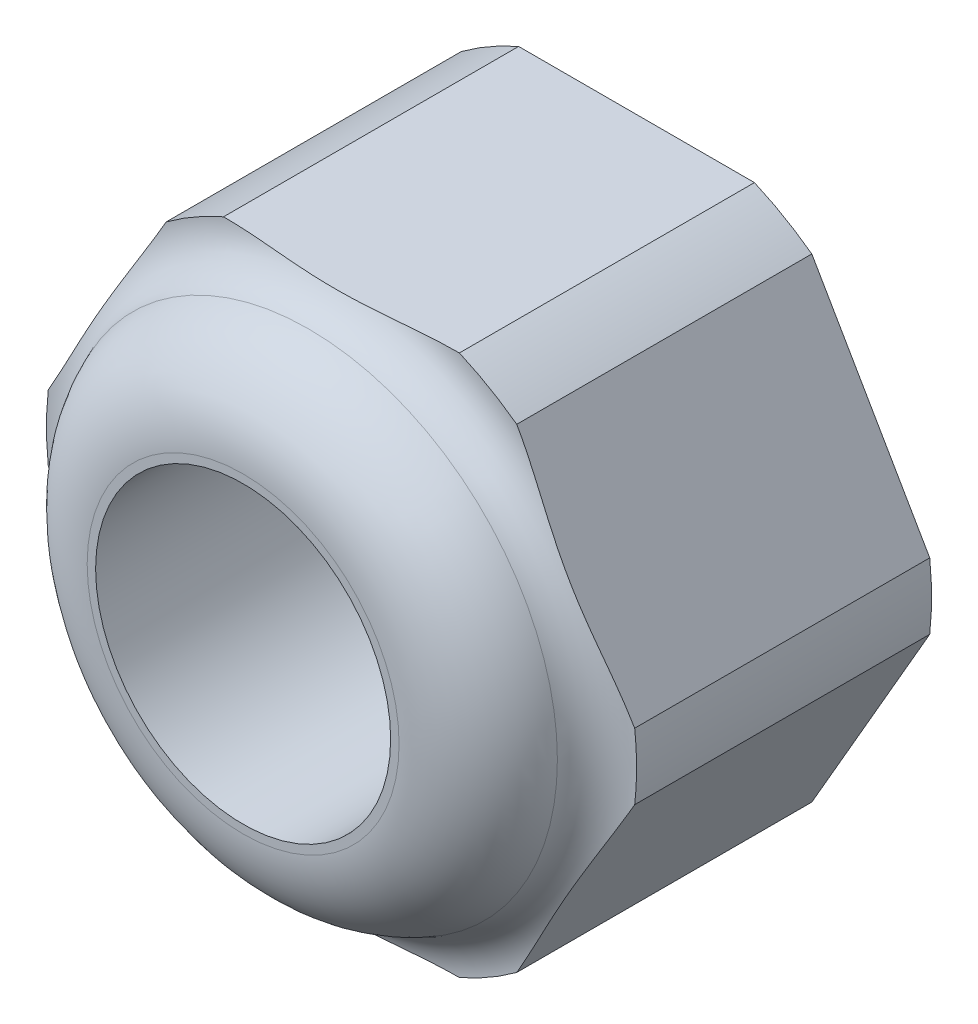
ISO-10303-21;
HEADER;
FILE_DESCRIPTION(('STEP AP214'),'2;1');
FILE_NAME('part.step','',(''),(''),'','','');
FILE_SCHEMA(('AUTOMOTIVE_DESIGN { 1 0 10303 214 1 1 1 1 }'));
ENDSEC;
DATA;
#1=APPLICATION_CONTEXT('core data for automotive mechanical design processes');
#2=APPLICATION_PROTOCOL_DEFINITION('international standard','automotive_design',2000,#1);
#3=PRODUCT_CONTEXT('',#1,'mechanical');
#4=PRODUCT('Part','Part','',(#3));
#5=PRODUCT_RELATED_PRODUCT_CATEGORY('part','',(#4));
#6=PRODUCT_DEFINITION_FORMATION('','',#4);
#7=PRODUCT_DEFINITION_CONTEXT('part definition',#1,'design');
#8=PRODUCT_DEFINITION('design','',#6,#7);
#9=PRODUCT_DEFINITION_SHAPE('','',#8);
#10=(LENGTH_UNIT() NAMED_UNIT(*) SI_UNIT(.MILLI.,.METRE.));
#11=(NAMED_UNIT(*) PLANE_ANGLE_UNIT() SI_UNIT($,.RADIAN.));
#12=(NAMED_UNIT(*) SI_UNIT($,.STERADIAN.) SOLID_ANGLE_UNIT());
#13=UNCERTAINTY_MEASURE_WITH_UNIT(LENGTH_MEASURE(1.E-05),#10,'distance_accuracy_value','');
#14=(GEOMETRIC_REPRESENTATION_CONTEXT(3) GLOBAL_UNCERTAINTY_ASSIGNED_CONTEXT((#13)) GLOBAL_UNIT_ASSIGNED_CONTEXT((#10,
#11,#12)) REPRESENTATION_CONTEXT('',''));
#15=CARTESIAN_POINT('',(0.,0.,0.));
#16=DIRECTION('',(0.,0.,1.));
#17=DIRECTION('',(1.,0.,0.));
#18=AXIS2_PLACEMENT_3D('',#15,#16,#17);
#19=CARTESIAN_POINT('',(0.,0.,3.5));
#20=DIRECTION('',(0.,0.,1.));
#21=DIRECTION('',(1.,0.,0.));
#22=AXIS2_PLACEMENT_3D('',#19,#20,#21);
#23=TOROIDAL_SURFACE('',#22,3.,0.5);
#24=CARTESIAN_POINT('',(0.,0.,3.33333333333333));
#25=DIRECTION('',(0.,0.,1.));
#26=DIRECTION('',(1.,0.,0.));
#27=AXIS2_PLACEMENT_3D('',#24,#25,#26);
#28=CIRCLE('',#27,2.52859547920897);
#29=CARTESIAN_POINT('',(2.52859547920897,0.,3.33333333333333));
#30=VERTEX_POINT('',#29);
#31=EDGE_CURVE('E11',#30,#30,#28,.F.);
#32=ORIENTED_EDGE('',*,*,#31,.T.);
#33=EDGE_LOOP('',(#32));
#34=FACE_BOUND('',#33,.T.);
#35=CARTESIAN_POINT('',(1.78209091999311,2.41332798286476,3.));
#36=CARTESIAN_POINT('',(1.8029816725476,2.37714413803205,3.00000547425712));
#37=CARTESIAN_POINT('',(1.82386584765849,2.34097168566582,3.00083574787663));
#38=CARTESIAN_POINT('',(1.86560264375872,2.26868143427508,3.00375141646616));
#39=CARTESIAN_POINT('',(1.88645527538926,2.23256361681946,3.00583617347954));
#40=CARTESIAN_POINT('',(1.94902940281862,2.12418204887252,3.01338977691186));
#41=CARTESIAN_POINT('',(1.99070767336444,2.05199316671556,3.02015570395621));
#42=CARTESIAN_POINT('',(2.0739935729532,1.90773775707374,3.03426237922139));
#43=CARTESIAN_POINT('',(2.11560123103605,1.8356711792903,3.04160254947552));
#44=CARTESIAN_POINT('',(2.17803423795269,1.72753403924138,3.05110621084151));
#45=CARTESIAN_POINT('',(2.19882868254042,1.69151700470026,3.05402090340439));
#46=CARTESIAN_POINT('',(2.24044188937087,1.61944081620404,3.05909348542903));
#47=CARTESIAN_POINT('',(2.26126065312444,1.58338165963208,3.06125132505298));
#48=CARTESIAN_POINT('',(2.32346222188901,1.47564538222136,3.06622297427866));
#49=CARTESIAN_POINT('',(2.36487889957214,1.40390959219347,3.06758531390029));
#50=CARTESIAN_POINT('',(2.44767731464131,1.26049853050749,3.06587724476535));
#51=CARTESIAN_POINT('',(2.48905905743415,1.18882324948454,3.06280774086636));
#52=CARTESIAN_POINT('',(2.57176728183577,1.04556840261714,3.05339463518524));
#53=CARTESIAN_POINT('',(2.6130936354751,0.973989058422262,3.04704706539339));
#54=CARTESIAN_POINT('',(2.69575147820008,0.830821475178555,3.03331051843544));
#55=CARTESIAN_POINT('',(2.73708290636901,0.759233341640578,3.02592022090021));
#56=CARTESIAN_POINT('',(2.82051114569872,0.614731392335512,3.01266035518556));
#57=CARTESIAN_POINT('',(2.86260915350769,0.541815503912941,3.00681841088733));
#58=CARTESIAN_POINT('',(2.94680082777401,0.395991246509396,2.99986043620046));
#59=CARTESIAN_POINT('',(2.98889401537968,0.323083706923831,2.99872828998619));
#60=CARTESIAN_POINT('',(3.05214406369327,0.213531409663516,3.00320588285245));
#61=CARTESIAN_POINT('',(3.07334947174844,0.176802565516735,3.00575550791994));
#62=CARTESIAN_POINT('',(3.11562191382036,0.103584548088145,3.01350482689503));
#63=CARTESIAN_POINT('',(3.13668906838841,0.0670951660053832,3.01870177384698));
#64=CARTESIAN_POINT('',(3.17882934922348,-0.00589394144618458,3.03247737515976));
#65=CARTESIAN_POINT('',(3.1998993036764,-0.0423881730718053,3.0410972050119));
#66=CARTESIAN_POINT('',(3.23113722915887,-0.0964938471304882,3.05719374044426));
#67=CARTESIAN_POINT('',(3.24150796968007,-0.114456496625324,3.06310124252167));
#68=CARTESIAN_POINT('',(3.26206989508195,-0.150070796122813,3.07610583684981));
#69=CARTESIAN_POINT('',(3.27226092513823,-0.167722177961749,3.08320390428611));
#70=CARTESIAN_POINT('',(3.28233200067718,-0.18516579248208,3.09095894618355));
#71=B_SPLINE_CURVE_WITH_KNOTS('',3,(#35,#36,#37,#38,#39,#40,#41,#42,#43,#44,#45,#46,#47,#48,#49,
#50,#51,#52,#53,#54,#55,#56,#57,#58,#59,#60,#61,#62,#63,#64,#65,#66,#67,#68,#69,#70),
.UNSPECIFIED.,.F.,.F.,(4,2,2,2,2,2,2,2,2,2,2,2,2,2,2,2,2,4),(0.,0.125318254788751,
0.250572833862227,0.501438397793515,0.752054639953766,0.877120806764332,1.00219520747735,
1.25060732931765,1.49896873957362,1.74763149169839,1.9966119906448,2.24977392501501,
2.50206888240246,2.62946504751806,2.75672929028217,2.88557322951092,2.95024030033934,
3.01496060061849),.UNSPECIFIED.);
#72=CARTESIAN_POINT('',(1.78209091999311,2.41332798286476,3.));
#73=VERTEX_POINT('',#72);
#74=CARTESIAN_POINT('',(2.9810488008213,0.336672017135238,3.));
#75=VERTEX_POINT('',#74);
#76=EDGE_CURVE('E25',#73,#75,#71,.T.);
#77=ORIENTED_EDGE('',*,*,#76,.F.);
#78=CARTESIAN_POINT('',(0.,0.,3.));
#79=DIRECTION('',(0.,0.,1.));
#80=DIRECTION('',(1.,0.,0.));
#81=AXIS2_PLACEMENT_3D('',#78,#79,#80);
#82=CIRCLE('',#81,3.);
#83=CARTESIAN_POINT('',(1.19895788082818,2.75,3.));
#84=VERTEX_POINT('',#83);
#85=EDGE_CURVE('E36',#84,#73,#82,.F.);
#86=ORIENTED_EDGE('',*,*,#85,.F.);
#87=CARTESIAN_POINT('',(-1.19895788082818,2.75,3.));
#88=CARTESIAN_POINT('',(-1.15717637571921,2.75,3.00000547425712));
#89=CARTESIAN_POINT('',(-1.11540802549744,2.75,3.00083574787663));
#90=CARTESIAN_POINT('',(-1.03193443329697,2.75,3.00375141646616));
#91=CARTESIAN_POINT('',(-0.990229170035885,2.75,3.00583617347954));
#92=CARTESIAN_POINT('',(-0.865080915177168,2.75,3.01338977691186));
#93=CARTESIAN_POINT('',(-0.781724374085529,2.75,3.02015570395621));
#94=CARTESIAN_POINT('',(-0.615152574908002,2.75,3.03426237922139));
#95=CARTESIAN_POINT('',(-0.531937258742313,2.75,3.04160254947552));
#96=CARTESIAN_POINT('',(-0.407071244909027,2.75,3.05110621084151));
#97=CARTESIAN_POINT('',(-0.365482355733569,2.75,3.05402090340439));
#98=CARTESIAN_POINT('',(-0.28225594207267,2.75,3.05909348542903));
#99=CARTESIAN_POINT('',(-0.240618414565522,2.75,3.06125132505298));
#100=CARTESIAN_POINT('',(-0.116215277036384,2.75,3.06622297427866));
#101=CARTESIAN_POINT('',(-0.033381921670122,2.75,3.06758531390029));
#102=CARTESIAN_POINT('',(0.132214908468218,2.75,3.06587724476535));
#103=CARTESIAN_POINT('',(0.214978394053901,2.75,3.06280774086636));
#104=CARTESIAN_POINT('',(0.380394842857132,2.75,3.05339463518524));
#105=CARTESIAN_POINT('',(0.463047550135789,2.75,3.04704706539339));
#106=CARTESIAN_POINT('',(0.628363235585754,2.75,3.03331051843544));
#107=CARTESIAN_POINT('',(0.711026091923622,2.75,3.02592022090021));
#108=CARTESIAN_POINT('',(0.877882570583033,2.75,3.01266035518556));
#109=CARTESIAN_POINT('',(0.962078586200977,2.75,3.00681841088733));
#110=CARTESIAN_POINT('',(1.1304619347336,2.75,2.99986043620046));
#111=CARTESIAN_POINT('',(1.21464830994496,2.75,2.99872828998619));
#112=CARTESIAN_POINT('',(1.34114840657213,2.75,3.00320588285245));
#113=CARTESIAN_POINT('',(1.38355922268247,2.75,3.00575550791994));
#114=CARTESIAN_POINT('',(1.46810410682632,2.75,3.01350482689503));
#115=CARTESIAN_POINT('',(1.51023841596241,2.75,3.01870177384698));
#116=CARTESIAN_POINT('',(1.59451897763256,2.75,3.03247737515976));
#117=CARTESIAN_POINT('',(1.6366588865384,2.75,3.0410972050119));
#118=CARTESIAN_POINT('',(1.69913473750333,2.75,3.05719374044426));
#119=CARTESIAN_POINT('',(1.71987621854574,2.75,3.06310124252168));
#120=CARTESIAN_POINT('',(1.76100006934949,2.75,3.07610583684981));
#121=CARTESIAN_POINT('',(1.78138212946205,2.75,3.08320390428611));
#122=CARTESIAN_POINT('',(1.80152428053995,2.75,3.09095894618355));
#123=B_SPLINE_CURVE_WITH_KNOTS('',3,(#87,#88,#89,#90,#91,#92,#93,#94,#95,#96,#97,#98,#99,#100,
#101,#102,#103,#104,#105,#106,#107,#108,#109,#110,#111,#112,#113,#114,#115,#116,#117,#118,#119,
#120,#121,#122),.UNSPECIFIED.,.F.,.F.,(4,2,2,2,2,2,2,2,2,2,2,2,2,2,2,2,2,4),(0.,
0.125318254788751,0.250572833862226,0.501438397793514,0.752054639953766,0.877120806764332,
1.00219520747735,1.25060732931765,1.49896873957362,1.74763149169839,1.9966119906448,
2.24977392501501,2.50206888240246,2.62946504751806,2.75672929028217,2.88557322951092,
2.95024030033934,3.01496060061849),.UNSPECIFIED.);
#124=CARTESIAN_POINT('',(-1.19895788082818,2.75,3.));
#125=VERTEX_POINT('',#124);
#126=EDGE_CURVE('E239',#125,#84,#123,.T.);
#127=ORIENTED_EDGE('',*,*,#126,.F.);
#128=CARTESIAN_POINT('',(0.,0.,3.));
#129=DIRECTION('',(0.,0.,1.));
#130=DIRECTION('',(1.,0.,0.));
#131=AXIS2_PLACEMENT_3D('',#128,#129,#130);
#132=CIRCLE('',#131,3.);
#133=CARTESIAN_POINT('',(-1.78209091999312,2.41332798286476,3.));
#134=VERTEX_POINT('',#133);
#135=EDGE_CURVE('E129',#134,#125,#132,.F.);
#136=ORIENTED_EDGE('',*,*,#135,.F.);
#137=CARTESIAN_POINT('',(-2.9810488008213,0.33667201713524,3.));
#138=CARTESIAN_POINT('',(-2.96015804826681,0.372855861967953,3.00000547425712));
#139=CARTESIAN_POINT('',(-2.93927387315593,0.409028314334177,3.00083574787663));
#140=CARTESIAN_POINT('',(-2.89753707705569,0.481318565724923,3.00375141646616));
#141=CARTESIAN_POINT('',(-2.87668444542515,0.517436383180541,3.00583617347954));
#142=CARTESIAN_POINT('',(-2.81411031799579,0.625817951127479,3.01338977691186));
#143=CARTESIAN_POINT('',(-2.77243204744997,0.69800683328444,3.02015570395621));
#144=CARTESIAN_POINT('',(-2.68914614786121,0.842262242926258,3.03426237922139));
#145=CARTESIAN_POINT('',(-2.64753848977836,0.914328820709698,3.04160254947552));
#146=CARTESIAN_POINT('',(-2.58510548286172,1.02246596075862,3.05110621084151));
#147=CARTESIAN_POINT('',(-2.56431103827399,1.05848299529975,3.05402090340439));
#148=CARTESIAN_POINT('',(-2.52269783144354,1.13055918379596,3.05909348542903));
#149=CARTESIAN_POINT('',(-2.50187906768997,1.16661834036792,3.06125132505298));
#150=CARTESIAN_POINT('',(-2.4396774989254,1.27435461777864,3.06622297427866));
#151=CARTESIAN_POINT('',(-2.39826082124227,1.34609040780653,3.06758531390029));
#152=CARTESIAN_POINT('',(-2.3154624061731,1.48950146949251,3.06587724476535));
#153=CARTESIAN_POINT('',(-2.27408066338026,1.56117675051546,3.06280774086636));
#154=CARTESIAN_POINT('',(-2.19137243897864,1.70443159738286,3.05339463518524));
#155=CARTESIAN_POINT('',(-2.15004608533931,1.77601094157774,3.04704706539339));
#156=CARTESIAN_POINT('',(-2.06738824261433,1.91917852482145,3.03331051843544));
#157=CARTESIAN_POINT('',(-2.0260568144454,1.99076665835942,3.02592022090021));
#158=CARTESIAN_POINT('',(-1.94262857511569,2.13526860766449,3.01266035518556));
#159=CARTESIAN_POINT('',(-1.90053056730672,2.20818449608706,3.00681841088733));
#160=CARTESIAN_POINT('',(-1.81633889304041,2.35400875349061,2.99986043620046));
#161=CARTESIAN_POINT('',(-1.77424570543473,2.42691629307617,2.99872828998619));
#162=CARTESIAN_POINT('',(-1.71099565712114,2.53646859033649,3.00320588285245));
#163=CARTESIAN_POINT('',(-1.68979024906597,2.57319743448327,3.00575550791994));
#164=CARTESIAN_POINT('',(-1.64751780699405,2.64641545191186,3.01350482689503));
#165=CARTESIAN_POINT('',(-1.626450652426,2.68290483399462,3.01870177384698));
#166=CARTESIAN_POINT('',(-1.58431037159093,2.75589394144619,3.03247737515976));
#167=CARTESIAN_POINT('',(-1.56324041713801,2.79238817307181,3.0410972050119));
#168=CARTESIAN_POINT('',(-1.53200249165554,2.84649384713049,3.05719374044426));
#169=CARTESIAN_POINT('',(-1.52163175113434,2.86445649662533,3.06310124252168));
#170=CARTESIAN_POINT('',(-1.50106982573246,2.90007079612281,3.07610583684981));
#171=CARTESIAN_POINT('',(-1.49087879567618,2.91772217796175,3.08320390428611));
#172=CARTESIAN_POINT('',(-1.48080772013723,2.93516579248208,3.09095894618355));
#173=B_SPLINE_CURVE_WITH_KNOTS('',3,(#137,#138,#139,#140,#141,#142,#143,#144,#145,#146,#147,
#148,#149,#150,#151,#152,#153,#154,#155,#156,#157,#158,#159,#160,#161,#162,#163,#164,#165,#166,
#167,#168,#169,#170,#171,#172),.UNSPECIFIED.,.F.,.F.,(4,2,2,2,2,2,2,2,2,2,2,2,2,2,2,2,2,4),(0.,
0.125318254788751,0.250572833862226,0.501438397793515,0.752054639953766,0.877120806764332,
1.00219520747735,1.25060732931765,1.49896873957362,1.74763149169839,1.9966119906448,
2.24977392501501,2.50206888240246,2.62946504751806,2.75672929028217,2.88557322951092,
2.95024030033934,3.01496060061849),.UNSPECIFIED.);
#174=CARTESIAN_POINT('',(-2.9810488008213,0.336672017135239,3.));
#175=VERTEX_POINT('',#174);
#176=EDGE_CURVE('E223',#175,#134,#173,.T.);
#177=ORIENTED_EDGE('',*,*,#176,.F.);
#178=CARTESIAN_POINT('',(0.,0.,3.));
#179=DIRECTION('',(0.,0.,1.));
#180=DIRECTION('',(1.,0.,0.));
#181=AXIS2_PLACEMENT_3D('',#178,#179,#180);
#182=CIRCLE('',#181,3.);
#183=CARTESIAN_POINT('',(-2.9810488008213,-0.336672017135243,3.));
#184=VERTEX_POINT('',#183);
#185=EDGE_CURVE('E220',#184,#175,#182,.F.);
#186=ORIENTED_EDGE('',*,*,#185,.F.);
#187=CARTESIAN_POINT('',(-1.78209091999312,-2.41332798286476,3.));
#188=CARTESIAN_POINT('',(-1.8029816725476,-2.37714413803204,3.00000547425712));
#189=CARTESIAN_POINT('',(-1.82386584765849,-2.34097168566582,3.00083574787663));
#190=CARTESIAN_POINT('',(-1.86560264375872,-2.26868143427507,3.00375141646616));
#191=CARTESIAN_POINT('',(-1.88645527538926,-2.23256361681946,3.00583617347954));
#192=CARTESIAN_POINT('',(-1.94902940281862,-2.12418204887252,3.01338977691186));
#193=CARTESIAN_POINT('',(-1.99070767336444,-2.05199316671556,3.02015570395621));
#194=CARTESIAN_POINT('',(-2.07399357295321,-1.90773775707374,3.03426237922139));
#195=CARTESIAN_POINT('',(-2.11560123103605,-1.8356711792903,3.04160254947552));
#196=CARTESIAN_POINT('',(-2.17803423795269,-1.72753403924137,3.05110621084151));
#197=CARTESIAN_POINT('',(-2.19882868254042,-1.69151700470025,3.05402090340439));
#198=CARTESIAN_POINT('',(-2.24044188937087,-1.61944081620404,3.05909348542903));
#199=CARTESIAN_POINT('',(-2.26126065312445,-1.58338165963208,3.06125132505298));
#200=CARTESIAN_POINT('',(-2.32346222188901,-1.47564538222135,3.06622297427866));
#201=CARTESIAN_POINT('',(-2.36487889957215,-1.40390959219347,3.06758531390029));
#202=CARTESIAN_POINT('',(-2.44767731464132,-1.26049853050749,3.06587724476535));
#203=CARTESIAN_POINT('',(-2.48905905743416,-1.18882324948454,3.06280774086636));
#204=CARTESIAN_POINT('',(-2.57176728183577,-1.04556840261714,3.05339463518524));
#205=CARTESIAN_POINT('',(-2.6130936354751,-0.973989058422259,3.04704706539339));
#206=CARTESIAN_POINT('',(-2.69575147820008,-0.830821475178551,3.03331051843544));
#207=CARTESIAN_POINT('',(-2.73708290636902,-0.759233341640574,3.02592022090021));
#208=CARTESIAN_POINT('',(-2.82051114569872,-0.614731392335508,3.01266035518556));
#209=CARTESIAN_POINT('',(-2.86260915350769,-0.541815503912937,3.00681841088733));
#210=CARTESIAN_POINT('',(-2.94680082777401,-0.395991246509392,2.99986043620046));
#211=CARTESIAN_POINT('',(-2.98889401537969,-0.323083706923827,2.99872828998619));
#212=CARTESIAN_POINT('',(-3.05214406369327,-0.213531409663512,3.00320588285245));
#213=CARTESIAN_POINT('',(-3.07334947174844,-0.176802565516731,3.00575550791994));
#214=CARTESIAN_POINT('',(-3.11562191382037,-0.103584548088141,3.01350482689503));
#215=CARTESIAN_POINT('',(-3.13668906838841,-0.0670951660053791,3.01870177384698));
#216=CARTESIAN_POINT('',(-3.17882934922349,0.00589394144618857,3.03247737515976));
#217=CARTESIAN_POINT('',(-3.19989930367641,0.0423881730718092,3.0410972050119));
#218=CARTESIAN_POINT('',(-3.23113722915887,0.0964938471304917,3.05719374044426));
#219=CARTESIAN_POINT('',(-3.24150796968008,0.114456496625328,3.06310124252168));
#220=CARTESIAN_POINT('',(-3.26206989508195,0.150070796122816,3.07610583684981));
#221=CARTESIAN_POINT('',(-3.27226092513823,0.167722177961752,3.08320390428611));
#222=CARTESIAN_POINT('',(-3.28233200067718,0.185165792482083,3.09095894618355));
#223=B_SPLINE_CURVE_WITH_KNOTS('',3,(#187,#188,#189,#190,#191,#192,#193,#194,#195,#196,#197,
#198,#199,#200,#201,#202,#203,#204,#205,#206,#207,#208,#209,#210,#211,#212,#213,#214,#215,#216,
#217,#218,#219,#220,#221,#222),.UNSPECIFIED.,.F.,.F.,(4,2,2,2,2,2,2,2,2,2,2,2,2,2,2,2,2,4),(0.,
0.125318254788751,0.250572833862226,0.501438397793515,0.752054639953766,0.877120806764333,
1.00219520747735,1.25060732931765,1.49896873957362,1.74763149169839,1.9966119906448,
2.24977392501501,2.50206888240246,2.62946504751806,2.75672929028217,2.88557322951092,
2.95024030033934,3.01496060061849),.UNSPECIFIED.);
#224=CARTESIAN_POINT('',(-1.78209091999312,-2.41332798286476,3.));
#225=VERTEX_POINT('',#224);
#226=EDGE_CURVE('E213',#225,#184,#223,.T.);
#227=ORIENTED_EDGE('',*,*,#226,.F.);
#228=CARTESIAN_POINT('',(0.,0.,3.));
#229=DIRECTION('',(0.,0.,1.));
#230=DIRECTION('',(1.,0.,0.));
#231=AXIS2_PLACEMENT_3D('',#228,#229,#230);
#232=CIRCLE('',#231,3.);
#233=CARTESIAN_POINT('',(-1.19895788082818,-2.75,3.));
#234=VERTEX_POINT('',#233);
#235=EDGE_CURVE('E210',#234,#225,#232,.F.);
#236=ORIENTED_EDGE('',*,*,#235,.F.);
#237=CARTESIAN_POINT('',(1.19895788082818,-2.75,3.));
#238=CARTESIAN_POINT('',(1.15717637571921,-2.75,3.00000547425712));
#239=CARTESIAN_POINT('',(1.11540802549744,-2.75,3.00083574787663));
#240=CARTESIAN_POINT('',(1.03193443329697,-2.75,3.00375141646616));
#241=CARTESIAN_POINT('',(0.990229170035887,-2.75,3.00583617347954));
#242=CARTESIAN_POINT('',(0.86508091517717,-2.75,3.01338977691186));
#243=CARTESIAN_POINT('',(0.781724374085531,-2.75,3.02015570395621));
#244=CARTESIAN_POINT('',(0.615152574908004,-2.75,3.03426237922139));
#245=CARTESIAN_POINT('',(0.531937258742315,-2.75,3.04160254947552));
#246=CARTESIAN_POINT('',(0.407071244909029,-2.75,3.05110621084151));
#247=CARTESIAN_POINT('',(0.365482355733571,-2.75,3.05402090340439));
#248=CARTESIAN_POINT('',(0.282255942072673,-2.75,3.05909348542903));
#249=CARTESIAN_POINT('',(0.240618414565524,-2.75,3.06125132505298));
#250=CARTESIAN_POINT('',(0.116215277036386,-2.75,3.06622297427866));
#251=CARTESIAN_POINT('',(0.033381921670124,-2.75,3.06758531390029));
#252=CARTESIAN_POINT('',(-0.132214908468216,-2.75,3.06587724476535));
#253=CARTESIAN_POINT('',(-0.214978394053899,-2.75,3.06280774086636));
#254=CARTESIAN_POINT('',(-0.380394842857129,-2.75,3.05339463518524));
#255=CARTESIAN_POINT('',(-0.463047550135787,-2.75,3.04704706539339));
#256=CARTESIAN_POINT('',(-0.628363235585752,-2.75,3.03331051843544));
#257=CARTESIAN_POINT('',(-0.71102609192362,-2.75,3.02592022090021));
#258=CARTESIAN_POINT('',(-0.877882570583031,-2.75,3.01266035518556));
#259=CARTESIAN_POINT('',(-0.962078586200975,-2.75,3.00681841088733));
#260=CARTESIAN_POINT('',(-1.1304619347336,-2.75,2.99986043620046));
#261=CARTESIAN_POINT('',(-1.21464830994496,-2.75,2.99872828998619));
#262=CARTESIAN_POINT('',(-1.34114840657213,-2.75,3.00320588285245));
#263=CARTESIAN_POINT('',(-1.38355922268247,-2.75,3.00575550791994));
#264=CARTESIAN_POINT('',(-1.46810410682632,-2.75,3.01350482689503));
#265=CARTESIAN_POINT('',(-1.51023841596241,-2.75,3.01870177384698));
#266=CARTESIAN_POINT('',(-1.59451897763256,-2.75,3.03247737515976));
#267=CARTESIAN_POINT('',(-1.6366588865384,-2.75,3.0410972050119));
#268=CARTESIAN_POINT('',(-1.69913473750333,-2.75,3.05719374044426));
#269=CARTESIAN_POINT('',(-1.71987621854574,-2.75,3.06310124252168));
#270=CARTESIAN_POINT('',(-1.76100006934949,-2.75,3.07610583684981));
#271=CARTESIAN_POINT('',(-1.78138212946204,-2.75,3.08320390428611));
#272=CARTESIAN_POINT('',(-1.80152428053995,-2.75,3.09095894618355));
#273=B_SPLINE_CURVE_WITH_KNOTS('',3,(#237,#238,#239,#240,#241,#242,#243,#244,#245,#246,#247,
#248,#249,#250,#251,#252,#253,#254,#255,#256,#257,#258,#259,#260,#261,#262,#263,#264,#265,#266,
#267,#268,#269,#270,#271,#272),.UNSPECIFIED.,.F.,.F.,(4,2,2,2,2,2,2,2,2,2,2,2,2,2,2,2,2,4),(0.,
0.125318254788751,0.250572833862226,0.501438397793515,0.752054639953766,0.877120806764332,
1.00219520747735,1.25060732931765,1.49896873957362,1.74763149169839,1.9966119906448,
2.24977392501501,2.50206888240246,2.62946504751806,2.75672929028217,2.88557322951092,
2.95024030033934,3.01496060061849),.UNSPECIFIED.);
#274=CARTESIAN_POINT('',(1.19895788082818,-2.75,3.));
#275=VERTEX_POINT('',#274);
#276=EDGE_CURVE('E203',#275,#234,#273,.T.);
#277=ORIENTED_EDGE('',*,*,#276,.F.);
#278=CARTESIAN_POINT('',(0.,0.,3.));
#279=DIRECTION('',(0.,0.,1.));
#280=DIRECTION('',(1.,0.,0.));
#281=AXIS2_PLACEMENT_3D('',#278,#279,#280);
#282=CIRCLE('',#281,3.);
#283=CARTESIAN_POINT('',(1.78209091999311,-2.41332798286476,3.));
#284=VERTEX_POINT('',#283);
#285=EDGE_CURVE('E185',#284,#275,#282,.F.);
#286=ORIENTED_EDGE('',*,*,#285,.F.);
#287=CARTESIAN_POINT('',(2.9810488008213,-0.336672017135235,3.));
#288=CARTESIAN_POINT('',(2.96015804826681,-0.372855861967949,3.00000547425712));
#289=CARTESIAN_POINT('',(2.93927387315593,-0.409028314334172,3.00083574787663));
#290=CARTESIAN_POINT('',(2.89753707705569,-0.481318565724919,3.00375141646616));
#291=CARTESIAN_POINT('',(2.87668444542515,-0.517436383180537,3.00583617347954));
#292=CARTESIAN_POINT('',(2.81411031799579,-0.625817951127475,3.01338977691186));
#293=CARTESIAN_POINT('',(2.77243204744997,-0.698006833284436,3.02015570395621));
#294=CARTESIAN_POINT('',(2.68914614786121,-0.842262242926254,3.03426237922139));
#295=CARTESIAN_POINT('',(2.64753848977836,-0.914328820709694,3.04160254947552));
#296=CARTESIAN_POINT('',(2.58510548286172,-1.02246596075862,3.05110621084151));
#297=CARTESIAN_POINT('',(2.56431103827399,-1.05848299529974,3.05402090340439));
#298=CARTESIAN_POINT('',(2.52269783144354,-1.13055918379595,3.05909348542903));
#299=CARTESIAN_POINT('',(2.50187906768997,-1.16661834036792,3.06125132505298));
#300=CARTESIAN_POINT('',(2.4396774989254,-1.27435461777864,3.06622297427866));
#301=CARTESIAN_POINT('',(2.39826082124227,-1.34609040780653,3.06758531390029));
#302=CARTESIAN_POINT('',(2.3154624061731,-1.4895014694925,3.06587724476535));
#303=CARTESIAN_POINT('',(2.27408066338026,-1.56117675051545,3.06280774086636));
#304=CARTESIAN_POINT('',(2.19137243897864,-1.70443159738286,3.05339463518524));
#305=CARTESIAN_POINT('',(2.15004608533931,-1.77601094157774,3.04704706539339));
#306=CARTESIAN_POINT('',(2.06738824261433,-1.91917852482144,3.03331051843544));
#307=CARTESIAN_POINT('',(2.0260568144454,-1.99076665835942,3.02592022090021));
#308=CARTESIAN_POINT('',(1.94262857511569,-2.13526860766449,3.01266035518556));
#309=CARTESIAN_POINT('',(1.90053056730672,-2.20818449608706,3.00681841088733));
#310=CARTESIAN_POINT('',(1.81633889304041,-2.3540087534906,2.99986043620046));
#311=CARTESIAN_POINT('',(1.77424570543473,-2.42691629307617,2.99872828998619));
#312=CARTESIAN_POINT('',(1.71099565712114,-2.53646859033648,3.00320588285245));
#313=CARTESIAN_POINT('',(1.68979024906597,-2.57319743448326,3.00575550791994));
#314=CARTESIAN_POINT('',(1.64751780699405,-2.64641545191185,3.01350482689503));
#315=CARTESIAN_POINT('',(1.626450652426,-2.68290483399461,3.01870177384698));
#316=CARTESIAN_POINT('',(1.58431037159093,-2.75589394144618,3.03247737515976));
#317=CARTESIAN_POINT('',(1.56324041713801,-2.7923881730718,3.0410972050119));
#318=CARTESIAN_POINT('',(1.53200249165554,-2.84649384713049,3.05719374044426));
#319=CARTESIAN_POINT('',(1.52163175113434,-2.86445649662532,3.06310124252167));
#320=CARTESIAN_POINT('',(1.50106982573246,-2.90007079612281,3.07610583684981));
#321=CARTESIAN_POINT('',(1.49087879567619,-2.91772217796175,3.08320390428611));
#322=CARTESIAN_POINT('',(1.48080772013723,-2.93516579248208,3.09095894618355));
#323=B_SPLINE_CURVE_WITH_KNOTS('',3,(#287,#288,#289,#290,#291,#292,#293,#294,#295,#296,#297,
#298,#299,#300,#301,#302,#303,#304,#305,#306,#307,#308,#309,#310,#311,#312,#313,#314,#315,#316,
#317,#318,#319,#320,#321,#322),.UNSPECIFIED.,.F.,.F.,(4,2,2,2,2,2,2,2,2,2,2,2,2,2,2,2,2,4),(0.,
0.12531825478875,0.250572833862226,0.501438397793515,0.752054639953766,0.877120806764332,
1.00219520747735,1.25060732931765,1.49896873957362,1.74763149169839,1.9966119906448,
2.24977392501501,2.50206888240246,2.62946504751806,2.75672929028217,2.88557322951092,
2.95024030033934,3.01496060061849),.UNSPECIFIED.);
#324=CARTESIAN_POINT('',(2.9810488008213,-0.336672017135237,3.));
#325=VERTEX_POINT('',#324);
#326=EDGE_CURVE('E177',#325,#284,#323,.T.);
#327=ORIENTED_EDGE('',*,*,#326,.F.);
#328=CARTESIAN_POINT('',(0.,0.,3.));
#329=DIRECTION('',(0.,0.,1.));
#330=DIRECTION('',(1.,0.,0.));
#331=AXIS2_PLACEMENT_3D('',#328,#329,#330);
#332=CIRCLE('',#331,3.);
#333=EDGE_CURVE('E174',#75,#325,#332,.F.);
#334=ORIENTED_EDGE('',*,*,#333,.F.);
#335=EDGE_LOOP('',(#77,#86,#127,#136,#177,#186,#227,#236,#277,#286,#327,#334));
#336=FACE_BOUND('',#335,.T.);
#337=ADVANCED_FACE('F17',(#34,#336),#23,.F.);
#338=CARTESIAN_POINT('',(-1.58771324027147,2.75,3.));
#339=DIRECTION('',(0.866025403784439,-0.5,0.));
#340=DIRECTION('',(0.5,0.866025403784439,0.));
#341=AXIS2_PLACEMENT_3D('',#338,#339,#340);
#342=PLANE('',#341);
#343=DIRECTION('',(-0.5,-0.866025403784439,0.));
#344=VECTOR('',#343,1.);
#345=CARTESIAN_POINT('',(-1.58771324027147,2.75,0.));
#346=LINE('',#345,#344);
#347=CARTESIAN_POINT('',(-1.78209091999312,2.41332798286476,0.));
#348=VERTEX_POINT('',#347);
#349=CARTESIAN_POINT('',(-2.9810488008213,0.336672017135239,0.));
#350=VERTEX_POINT('',#349);
#351=EDGE_CURVE('E122',#348,#350,#346,.T.);
#352=ORIENTED_EDGE('',*,*,#351,.T.);
#353=DIRECTION('',(0.,0.,1.));
#354=VECTOR('',#353,1.);
#355=CARTESIAN_POINT('',(-2.9810488008213,0.336672017135239,-7.));
#356=LINE('',#355,#354);
#357=EDGE_CURVE('E170',#350,#175,#356,.T.);
#358=ORIENTED_EDGE('',*,*,#357,.T.);
#359=ORIENTED_EDGE('',*,*,#176,.T.);
#360=DIRECTION('',(0.,0.,1.));
#361=VECTOR('',#360,1.);
#362=CARTESIAN_POINT('',(-1.78209091999312,2.41332798286476,-7.));
#363=LINE('',#362,#361);
#364=EDGE_CURVE('E168',#348,#134,#363,.T.);
#365=ORIENTED_EDGE('',*,*,#364,.F.);
#366=EDGE_LOOP('',(#352,#358,#359,#365));
#367=FACE_BOUND('',#366,.T.);
#368=ADVANCED_FACE('F231',(#367),#342,.F.);
#369=CARTESIAN_POINT('',(-3.17542648054294,0.,3.));
#370=DIRECTION('',(0.866025403784439,0.5,0.));
#371=DIRECTION('',(-0.5,0.866025403784439,0.));
#372=AXIS2_PLACEMENT_3D('',#369,#370,#371);
#373=PLANE('',#372);
#374=ORIENTED_EDGE('',*,*,#226,.T.);
#375=DIRECTION('',(0.,0.,1.));
#376=VECTOR('',#375,1.);
#377=CARTESIAN_POINT('',(-2.9810488008213,-0.336672017135243,-7.));
#378=LINE('',#377,#376);
#379=CARTESIAN_POINT('',(-2.9810488008213,-0.336672017135243,0.));
#380=VERTEX_POINT('',#379);
#381=EDGE_CURVE('E165',#380,#184,#378,.T.);
#382=ORIENTED_EDGE('',*,*,#381,.F.);
#383=DIRECTION('',(0.5,-0.866025403784439,0.));
#384=VECTOR('',#383,1.);
#385=CARTESIAN_POINT('',(-3.17542648054294,0.,0.));
#386=LINE('',#385,#384);
#387=CARTESIAN_POINT('',(-1.78209091999312,-2.41332798286476,0.));
#388=VERTEX_POINT('',#387);
#389=EDGE_CURVE('E163',#380,#388,#386,.T.);
#390=ORIENTED_EDGE('',*,*,#389,.T.);
#391=DIRECTION('',(0.,0.,1.));
#392=VECTOR('',#391,1.);
#393=CARTESIAN_POINT('',(-1.78209091999312,-2.41332798286476,-7.));
#394=LINE('',#393,#392);
#395=EDGE_CURVE('E160',#388,#225,#394,.T.);
#396=ORIENTED_EDGE('',*,*,#395,.T.);
#397=EDGE_LOOP('',(#374,#382,#390,#396));
#398=FACE_BOUND('',#397,.T.);
#399=ADVANCED_FACE('F199',(#398),#373,.F.);
#400=CARTESIAN_POINT('',(-1.58771324027147,-2.75,3.));
#401=DIRECTION('',(0.,1.,0.));
#402=DIRECTION('',(0.,0.,1.));
#403=AXIS2_PLACEMENT_3D('',#400,#401,#402);
#404=PLANE('',#403);
#405=DIRECTION('',(1.,0.,0.));
#406=VECTOR('',#405,1.);
#407=CARTESIAN_POINT('',(-1.58771324027147,-2.75,0.));
#408=LINE('',#407,#406);
#409=CARTESIAN_POINT('',(-1.19895788082818,-2.75,0.));
#410=VERTEX_POINT('',#409);
#411=CARTESIAN_POINT('',(1.19895788082818,-2.75,0.));
#412=VERTEX_POINT('',#411);
#413=EDGE_CURVE('E158',#410,#412,#408,.T.);
#414=ORIENTED_EDGE('',*,*,#413,.T.);
#415=DIRECTION('',(0.,0.,1.));
#416=VECTOR('',#415,1.);
#417=CARTESIAN_POINT('',(1.19895788082818,-2.75,-7.));
#418=LINE('',#417,#416);
#419=EDGE_CURVE('E155',#412,#275,#418,.T.);
#420=ORIENTED_EDGE('',*,*,#419,.T.);
#421=ORIENTED_EDGE('',*,*,#276,.T.);
#422=DIRECTION('',(0.,0.,1.));
#423=VECTOR('',#422,1.);
#424=CARTESIAN_POINT('',(-1.19895788082818,-2.75,-7.));
#425=LINE('',#424,#423);
#426=EDGE_CURVE('E152',#410,#234,#425,.T.);
#427=ORIENTED_EDGE('',*,*,#426,.F.);
#428=EDGE_LOOP('',(#414,#420,#421,#427));
#429=FACE_BOUND('',#428,.T.);
#430=ADVANCED_FACE('F193',(#429),#404,.F.);
#431=CARTESIAN_POINT('',(1.58771324027147,-2.75,3.));
#432=DIRECTION('',(-0.866025403784439,0.5,0.));
#433=DIRECTION('',(-0.5,-0.866025403784439,0.));
#434=AXIS2_PLACEMENT_3D('',#431,#432,#433);
#435=PLANE('',#434);
#436=ORIENTED_EDGE('',*,*,#326,.T.);
#437=DIRECTION('',(0.,0.,1.));
#438=VECTOR('',#437,1.);
#439=CARTESIAN_POINT('',(1.78209091999311,-2.41332798286476,-7.));
#440=LINE('',#439,#438);
#441=CARTESIAN_POINT('',(1.78209091999311,-2.41332798286476,0.));
#442=VERTEX_POINT('',#441);
#443=EDGE_CURVE('E149',#442,#284,#440,.T.);
#444=ORIENTED_EDGE('',*,*,#443,.F.);
#445=DIRECTION('',(0.5,0.866025403784439,0.));
#446=VECTOR('',#445,1.);
#447=CARTESIAN_POINT('',(1.58771324027147,-2.75,0.));
#448=LINE('',#447,#446);
#449=CARTESIAN_POINT('',(2.9810488008213,-0.336672017135235,0.));
#450=VERTEX_POINT('',#449);
#451=EDGE_CURVE('E147',#442,#450,#448,.T.);
#452=ORIENTED_EDGE('',*,*,#451,.T.);
#453=DIRECTION('',(0.,0.,1.));
#454=VECTOR('',#453,1.);
#455=CARTESIAN_POINT('',(2.9810488008213,-0.336672017135237,-7.));
#456=LINE('',#455,#454);
#457=EDGE_CURVE('E144',#450,#325,#456,.T.);
#458=ORIENTED_EDGE('',*,*,#457,.T.);
#459=EDGE_LOOP('',(#436,#444,#452,#458));
#460=FACE_BOUND('',#459,.T.);
#461=ADVANCED_FACE('F187',(#460),#435,.F.);
#462=CARTESIAN_POINT('',(3.17542648054294,0.,3.));
#463=DIRECTION('',(-0.866025403784438,-0.5,0.));
#464=DIRECTION('',(0.5,-0.866025403784439,0.));
#465=AXIS2_PLACEMENT_3D('',#462,#463,#464);
#466=PLANE('',#465);
#467=ORIENTED_EDGE('',*,*,#76,.T.);
#468=DIRECTION('',(0.,0.,1.));
#469=VECTOR('',#468,1.);
#470=CARTESIAN_POINT('',(2.9810488008213,0.336672017135238,-7.));
#471=LINE('',#470,#469);
#472=CARTESIAN_POINT('',(2.9810488008213,0.336672017135238,0.));
#473=VERTEX_POINT('',#472);
#474=EDGE_CURVE('E141',#473,#75,#471,.T.);
#475=ORIENTED_EDGE('',*,*,#474,.F.);
#476=DIRECTION('',(-0.5,0.866025403784439,0.));
#477=VECTOR('',#476,1.);
#478=CARTESIAN_POINT('',(3.17542648054294,0.,0.));
#479=LINE('',#478,#477);
#480=CARTESIAN_POINT('',(1.78209091999311,2.41332798286476,0.));
#481=VERTEX_POINT('',#480);
#482=EDGE_CURVE('E139',#473,#481,#479,.T.);
#483=ORIENTED_EDGE('',*,*,#482,.T.);
#484=DIRECTION('',(0.,0.,1.));
#485=VECTOR('',#484,1.);
#486=CARTESIAN_POINT('',(1.78209091999311,2.41332798286476,-7.));
#487=LINE('',#486,#485);
#488=EDGE_CURVE('E137',#481,#73,#487,.T.);
#489=ORIENTED_EDGE('',*,*,#488,.T.);
#490=EDGE_LOOP('',(#467,#475,#483,#489));
#491=FACE_BOUND('',#490,.T.);
#492=ADVANCED_FACE('F192',(#491),#466,.F.);
#493=CARTESIAN_POINT('',(1.58771324027147,2.75,3.));
#494=DIRECTION('',(0.,-1.,0.));
#495=DIRECTION('',(0.,0.,-1.));
#496=AXIS2_PLACEMENT_3D('',#493,#494,#495);
#497=PLANE('',#496);
#498=ORIENTED_EDGE('',*,*,#126,.T.);
#499=DIRECTION('',(0.,0.,1.));
#500=VECTOR('',#499,1.);
#501=CARTESIAN_POINT('',(1.19895788082818,2.75,-7.));
#502=LINE('',#501,#500);
#503=CARTESIAN_POINT('',(1.19895788082818,2.75,0.));
#504=VERTEX_POINT('',#503);
#505=EDGE_CURVE('E111',#504,#84,#502,.T.);
#506=ORIENTED_EDGE('',*,*,#505,.F.);
#507=DIRECTION('',(-1.,0.,0.));
#508=VECTOR('',#507,1.);
#509=CARTESIAN_POINT('',(1.58771324027147,2.75,0.));
#510=LINE('',#509,#508);
#511=CARTESIAN_POINT('',(-1.19895788082818,2.75,0.));
#512=VERTEX_POINT('',#511);
#513=EDGE_CURVE('E104',#504,#512,#510,.T.);
#514=ORIENTED_EDGE('',*,*,#513,.T.);
#515=DIRECTION('',(0.,0.,1.));
#516=VECTOR('',#515,1.);
#517=CARTESIAN_POINT('',(-1.19895788082818,2.75,-7.));
#518=LINE('',#517,#516);
#519=EDGE_CURVE('E108',#512,#125,#518,.T.);
#520=ORIENTED_EDGE('',*,*,#519,.T.);
#521=EDGE_LOOP('',(#498,#506,#514,#520));
#522=FACE_BOUND('',#521,.T.);
#523=ADVANCED_FACE('F106',(#522),#497,.F.);
#524=CARTESIAN_POINT('',(0.,0.,0.));
#525=DIRECTION('',(0.,0.,1.));
#526=DIRECTION('',(1.,0.,0.));
#527=AXIS2_PLACEMENT_3D('',#524,#525,#526);
#528=PLANE('',#527);
#529=CARTESIAN_POINT('',(0.,0.,0.));
#530=DIRECTION('',(0.,0.,1.));
#531=DIRECTION('',(1.,0.,0.));
#532=AXIS2_PLACEMENT_3D('',#529,#530,#531);
#533=CIRCLE('',#532,1.5);
#534=CARTESIAN_POINT('',(1.5,0.,0.));
#535=VERTEX_POINT('',#534);
#536=EDGE_CURVE('E130',#535,#535,#533,.T.);
#537=ORIENTED_EDGE('',*,*,#536,.T.);
#538=EDGE_LOOP('',(#537));
#539=FACE_BOUND('',#538,.T.);
#540=ORIENTED_EDGE('',*,*,#389,.F.);
#541=CARTESIAN_POINT('',(0.,0.,0.));
#542=DIRECTION('',(0.,0.,1.));
#543=DIRECTION('',(1.,0.,0.));
#544=AXIS2_PLACEMENT_3D('',#541,#542,#543);
#545=CIRCLE('',#544,3.);
#546=EDGE_CURVE('E125',#380,#350,#545,.F.);
#547=ORIENTED_EDGE('',*,*,#546,.T.);
#548=ORIENTED_EDGE('',*,*,#351,.F.);
#549=CARTESIAN_POINT('',(0.,0.,0.));
#550=DIRECTION('',(0.,0.,1.));
#551=DIRECTION('',(1.,0.,0.));
#552=AXIS2_PLACEMENT_3D('',#549,#550,#551);
#553=CIRCLE('',#552,3.);
#554=EDGE_CURVE('E118',#348,#512,#553,.F.);
#555=ORIENTED_EDGE('',*,*,#554,.T.);
#556=ORIENTED_EDGE('',*,*,#513,.F.);
#557=CARTESIAN_POINT('',(0.,0.,0.));
#558=DIRECTION('',(0.,0.,1.));
#559=DIRECTION('',(1.,0.,0.));
#560=AXIS2_PLACEMENT_3D('',#557,#558,#559);
#561=CIRCLE('',#560,3.);
#562=EDGE_CURVE('E126',#504,#481,#561,.F.);
#563=ORIENTED_EDGE('',*,*,#562,.T.);
#564=ORIENTED_EDGE('',*,*,#482,.F.);
#565=CARTESIAN_POINT('',(0.,0.,0.));
#566=DIRECTION('',(0.,0.,1.));
#567=DIRECTION('',(1.,0.,0.));
#568=AXIS2_PLACEMENT_3D('',#565,#566,#567);
#569=CIRCLE('',#568,3.);
#570=EDGE_CURVE('E257',#473,#450,#569,.F.);
#571=ORIENTED_EDGE('',*,*,#570,.T.);
#572=ORIENTED_EDGE('',*,*,#451,.F.);
#573=CARTESIAN_POINT('',(0.,0.,0.));
#574=DIRECTION('',(0.,0.,1.));
#575=DIRECTION('',(1.,0.,0.));
#576=AXIS2_PLACEMENT_3D('',#573,#574,#575);
#577=CIRCLE('',#576,3.);
#578=EDGE_CURVE('E259',#442,#412,#577,.F.);
#579=ORIENTED_EDGE('',*,*,#578,.T.);
#580=ORIENTED_EDGE('',*,*,#413,.F.);
#581=CARTESIAN_POINT('',(0.,0.,0.));
#582=DIRECTION('',(0.,0.,1.));
#583=DIRECTION('',(1.,0.,0.));
#584=AXIS2_PLACEMENT_3D('',#581,#582,#583);
#585=CIRCLE('',#584,3.);
#586=EDGE_CURVE('E263',#410,#388,#585,.F.);
#587=ORIENTED_EDGE('',*,*,#586,.T.);
#588=EDGE_LOOP('',(#540,#547,#548,#555,#556,#563,#564,#571,#572,#579,#580,#587));
#589=FACE_BOUND('',#588,.T.);
#590=ADVANCED_FACE('F120',(#539,#589),#528,.F.);
#591=CARTESIAN_POINT('',(0.,0.,4.));
#592=DIRECTION('',(0.,0.,1.));
#593=DIRECTION('',(1.,0.,0.));
#594=AXIS2_PLACEMENT_3D('',#591,#592,#593);
#595=PLANE('',#594);
#596=CARTESIAN_POINT('',(0.,0.,4.));
#597=DIRECTION('',(0.,0.,1.));
#598=DIRECTION('',(1.,0.,0.));
#599=AXIS2_PLACEMENT_3D('',#596,#597,#598);
#600=CIRCLE('',#599,1.58578643762691);
#601=CARTESIAN_POINT('',(1.58578643762691,0.,4.));
#602=VERTEX_POINT('',#601);
#603=EDGE_CURVE('E297',#602,#602,#600,.T.);
#604=ORIENTED_EDGE('',*,*,#603,.T.);
#605=EDGE_LOOP('',(#604));
#606=FACE_BOUND('',#605,.T.);
#607=CARTESIAN_POINT('',(0.,0.,4.));
#608=DIRECTION('',(0.,0.,1.));
#609=DIRECTION('',(1.,0.,0.));
#610=AXIS2_PLACEMENT_3D('',#607,#608,#609);
#611=CIRCLE('',#610,1.5);
#612=CARTESIAN_POINT('',(1.5,0.,4.));
#613=VERTEX_POINT('',#612);
#614=EDGE_CURVE('E299',#613,#613,#611,.T.);
#615=ORIENTED_EDGE('',*,*,#614,.F.);
#616=EDGE_LOOP('',(#615));
#617=FACE_BOUND('',#616,.T.);
#618=ADVANCED_FACE('F307',(#606,#617),#595,.T.);
#619=CARTESIAN_POINT('',(0.,0.,4.));
#620=DIRECTION('',(0.,0.,-1.));
#621=DIRECTION('',(-1.,0.,0.));
#622=AXIS2_PLACEMENT_3D('',#619,#620,#621);
#623=CYLINDRICAL_SURFACE('',#622,1.5);
#624=ORIENTED_EDGE('',*,*,#614,.T.);
#625=EDGE_LOOP('',(#624));
#626=FACE_BOUND('',#625,.T.);
#627=ORIENTED_EDGE('',*,*,#536,.F.);
#628=EDGE_LOOP('',(#627));
#629=FACE_BOUND('',#628,.T.);
#630=ADVANCED_FACE('F293',(#626,#629),#623,.F.);
#631=CARTESIAN_POINT('',(0.,0.,3.));
#632=DIRECTION('',(0.,0.,-1.));
#633=DIRECTION('',(-1.,0.,0.));
#634=AXIS2_PLACEMENT_3D('',#631,#632,#633);
#635=TOROIDAL_SURFACE('',#634,1.58578643762691,1.);
#636=ORIENTED_EDGE('',*,*,#31,.F.);
#637=EDGE_LOOP('',(#636));
#638=FACE_BOUND('',#637,.T.);
#639=ORIENTED_EDGE('',*,*,#603,.F.);
#640=EDGE_LOOP('',(#639));
#641=FACE_BOUND('',#640,.T.);
#642=ADVANCED_FACE('F290',(#638,#641),#635,.T.);
#643=CARTESIAN_POINT('',(0.,0.,-7.));
#644=DIRECTION('',(0.,0.,1.));
#645=DIRECTION('',(1.,0.,0.));
#646=AXIS2_PLACEMENT_3D('',#643,#644,#645);
#647=CYLINDRICAL_SURFACE('',#646,3.);
#648=ORIENTED_EDGE('',*,*,#426,.T.);
#649=ORIENTED_EDGE('',*,*,#235,.T.);
#650=ORIENTED_EDGE('',*,*,#395,.F.);
#651=ORIENTED_EDGE('',*,*,#586,.F.);
#652=EDGE_LOOP('',(#648,#649,#650,#651));
#653=FACE_BOUND('',#652,.T.);
#654=ADVANCED_FACE('F282',(#653),#647,.T.);
#655=CARTESIAN_POINT('',(0.,0.,-7.));
#656=DIRECTION('',(0.,0.,1.));
#657=DIRECTION('',(1.,0.,0.));
#658=AXIS2_PLACEMENT_3D('',#655,#656,#657);
#659=CYLINDRICAL_SURFACE('',#658,3.);
#660=ORIENTED_EDGE('',*,*,#364,.T.);
#661=ORIENTED_EDGE('',*,*,#135,.T.);
#662=ORIENTED_EDGE('',*,*,#519,.F.);
#663=ORIENTED_EDGE('',*,*,#554,.F.);
#664=EDGE_LOOP('',(#660,#661,#662,#663));
#665=FACE_BOUND('',#664,.T.);
#666=ADVANCED_FACE('F128',(#665),#659,.T.);
#667=CARTESIAN_POINT('',(0.,0.,-7.));
#668=DIRECTION('',(0.,0.,1.));
#669=DIRECTION('',(1.,0.,0.));
#670=AXIS2_PLACEMENT_3D('',#667,#668,#669);
#671=CYLINDRICAL_SURFACE('',#670,3.);
#672=ORIENTED_EDGE('',*,*,#505,.T.);
#673=ORIENTED_EDGE('',*,*,#85,.T.);
#674=ORIENTED_EDGE('',*,*,#488,.F.);
#675=ORIENTED_EDGE('',*,*,#562,.F.);
#676=EDGE_LOOP('',(#672,#673,#674,#675));
#677=FACE_BOUND('',#676,.T.);
#678=ADVANCED_FACE('F272',(#677),#671,.T.);
#679=CARTESIAN_POINT('',(0.,0.,-7.));
#680=DIRECTION('',(0.,0.,1.));
#681=DIRECTION('',(1.,0.,0.));
#682=AXIS2_PLACEMENT_3D('',#679,#680,#681);
#683=CYLINDRICAL_SURFACE('',#682,3.);
#684=ORIENTED_EDGE('',*,*,#474,.T.);
#685=ORIENTED_EDGE('',*,*,#333,.T.);
#686=ORIENTED_EDGE('',*,*,#457,.F.);
#687=ORIENTED_EDGE('',*,*,#570,.F.);
#688=EDGE_LOOP('',(#684,#685,#686,#687));
#689=FACE_BOUND('',#688,.T.);
#690=ADVANCED_FACE('F254',(#689),#683,.T.);
#691=CARTESIAN_POINT('',(0.,0.,-7.));
#692=DIRECTION('',(0.,0.,1.));
#693=DIRECTION('',(1.,0.,0.));
#694=AXIS2_PLACEMENT_3D('',#691,#692,#693);
#695=CYLINDRICAL_SURFACE('',#694,3.);
#696=ORIENTED_EDGE('',*,*,#443,.T.);
#697=ORIENTED_EDGE('',*,*,#285,.T.);
#698=ORIENTED_EDGE('',*,*,#419,.F.);
#699=ORIENTED_EDGE('',*,*,#578,.F.);
#700=EDGE_LOOP('',(#696,#697,#698,#699));
#701=FACE_BOUND('',#700,.T.);
#702=ADVANCED_FACE('F280',(#701),#695,.T.);
#703=CARTESIAN_POINT('',(0.,0.,-7.));
#704=DIRECTION('',(0.,0.,1.));
#705=DIRECTION('',(1.,0.,0.));
#706=AXIS2_PLACEMENT_3D('',#703,#704,#705);
#707=CYLINDRICAL_SURFACE('',#706,3.);
#708=ORIENTED_EDGE('',*,*,#381,.T.);
#709=ORIENTED_EDGE('',*,*,#185,.T.);
#710=ORIENTED_EDGE('',*,*,#357,.F.);
#711=ORIENTED_EDGE('',*,*,#546,.F.);
#712=EDGE_LOOP('',(#708,#709,#710,#711));
#713=FACE_BOUND('',#712,.T.);
#714=ADVANCED_FACE('F270',(#713),#707,.T.);
#715=CLOSED_SHELL('',(#337,#368,#399,#430,#461,#492,#523,#590,#618,#630,#642,#654,#666,#678,
#690,#702,#714));
#716=MANIFOLD_SOLID_BREP('B1',#715);
#717=ADVANCED_BREP_SHAPE_REPRESENTATION('',(#18,#716),#14);
#718=SHAPE_DEFINITION_REPRESENTATION(#9,#717);
ENDSEC;
END-ISO-10303-21;
